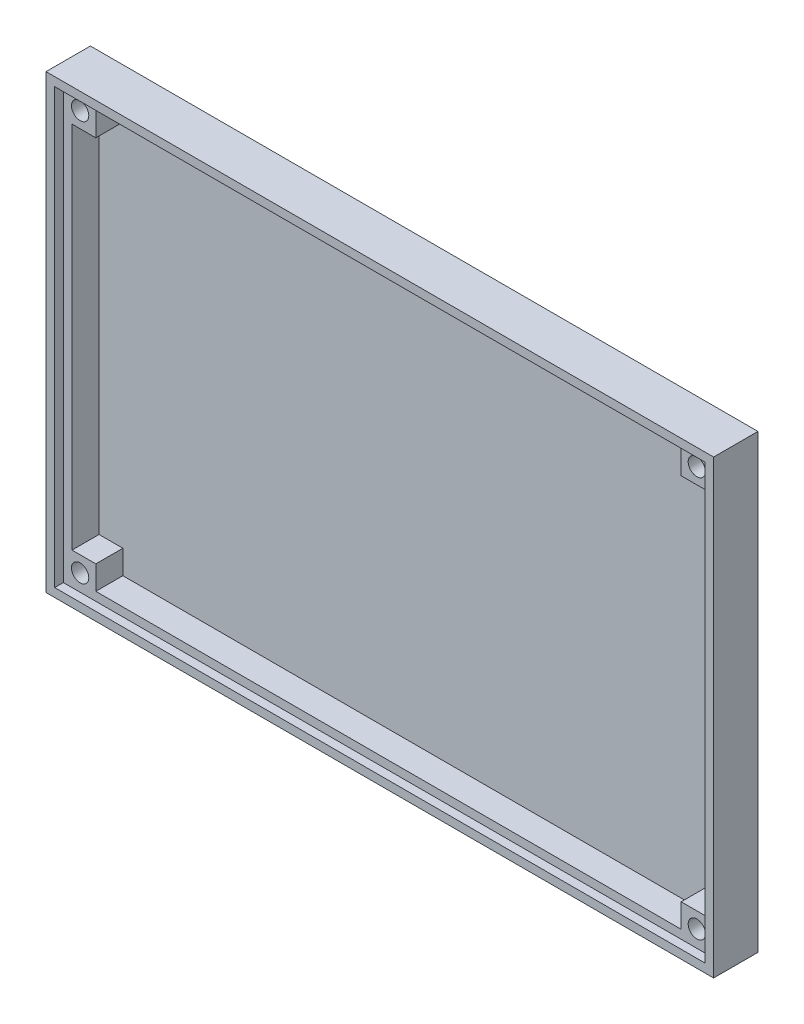
ISO-10303-21;
HEADER;
FILE_DESCRIPTION(('STEP AP214'),'2;1');
FILE_NAME('part.step','',(''),(''),'','','');
FILE_SCHEMA(('AUTOMOTIVE_DESIGN { 1 0 10303 214 1 1 1 1 }'));
ENDSEC;
DATA;
#1=APPLICATION_CONTEXT('core data for automotive mechanical design processes');
#2=APPLICATION_PROTOCOL_DEFINITION('international standard','automotive_design',2000,#1);
#3=PRODUCT_CONTEXT('',#1,'mechanical');
#4=PRODUCT('Part','Part','',(#3));
#5=PRODUCT_RELATED_PRODUCT_CATEGORY('part','',(#4));
#6=PRODUCT_DEFINITION_FORMATION('','',#4);
#7=PRODUCT_DEFINITION_CONTEXT('part definition',#1,'design');
#8=PRODUCT_DEFINITION('design','',#6,#7);
#9=PRODUCT_DEFINITION_SHAPE('','',#8);
#10=(LENGTH_UNIT() NAMED_UNIT(*) SI_UNIT(.MILLI.,.METRE.));
#11=(NAMED_UNIT(*) PLANE_ANGLE_UNIT() SI_UNIT($,.RADIAN.));
#12=(NAMED_UNIT(*) SI_UNIT($,.STERADIAN.) SOLID_ANGLE_UNIT());
#13=UNCERTAINTY_MEASURE_WITH_UNIT(LENGTH_MEASURE(1.E-05),#10,'distance_accuracy_value','');
#14=(GEOMETRIC_REPRESENTATION_CONTEXT(3) GLOBAL_UNCERTAINTY_ASSIGNED_CONTEXT((#13)) GLOBAL_UNIT_ASSIGNED_CONTEXT((#10,
#11,#12)) REPRESENTATION_CONTEXT('',''));
#15=CARTESIAN_POINT('',(0.,0.,0.));
#16=DIRECTION('',(0.,0.,1.));
#17=DIRECTION('',(1.,0.,0.));
#18=AXIS2_PLACEMENT_3D('',#15,#16,#17);
#19=CARTESIAN_POINT('',(0.,0.,8.2));
#20=DIRECTION('',(0.,0.,1.));
#21=DIRECTION('',(1.,0.,0.));
#22=AXIS2_PLACEMENT_3D('',#19,#20,#21);
#23=PLANE('',#22);
#24=DIRECTION('',(-1.,0.,0.));
#25=VECTOR('',#24,1.);
#26=CARTESIAN_POINT('',(61.7,41.7,8.2));
#27=LINE('',#26,#25);
#28=CARTESIAN_POINT('',(61.7,41.7,8.2));
#29=VERTEX_POINT('',#28);
#30=CARTESIAN_POINT('',(-61.7,41.7,8.2));
#31=VERTEX_POINT('',#30);
#32=EDGE_CURVE('E356',#29,#31,#27,.T.);
#33=ORIENTED_EDGE('',*,*,#32,.T.);
#34=DIRECTION('',(0.,-1.,0.));
#35=VECTOR('',#34,1.);
#36=CARTESIAN_POINT('',(-61.7,41.7,8.2));
#37=LINE('',#36,#35);
#38=CARTESIAN_POINT('',(-61.7,-41.7,8.2));
#39=VERTEX_POINT('',#38);
#40=EDGE_CURVE('E360',#31,#39,#37,.T.);
#41=ORIENTED_EDGE('',*,*,#40,.T.);
#42=DIRECTION('',(1.,0.,0.));
#43=VECTOR('',#42,1.);
#44=CARTESIAN_POINT('',(-61.7,-41.7,8.2));
#45=LINE('',#44,#43);
#46=CARTESIAN_POINT('',(61.7,-41.7,8.2));
#47=VERTEX_POINT('',#46);
#48=EDGE_CURVE('E364',#39,#47,#45,.T.);
#49=ORIENTED_EDGE('',*,*,#48,.T.);
#50=DIRECTION('',(0.,1.,0.));
#51=VECTOR('',#50,1.);
#52=CARTESIAN_POINT('',(61.7,-41.7,8.2));
#53=LINE('',#52,#51);
#54=EDGE_CURVE('E367',#47,#29,#53,.T.);
#55=ORIENTED_EDGE('',*,*,#54,.T.);
#56=EDGE_LOOP('',(#33,#41,#49,#55));
#57=FACE_BOUND('',#56,.T.);
#58=DIRECTION('',(0.,-1.,0.));
#59=VECTOR('',#58,1.);
#60=CARTESIAN_POINT('',(-60.1,40.1,8.2));
#61=LINE('',#60,#59);
#62=CARTESIAN_POINT('',(-60.1,40.1,8.2));
#63=VERTEX_POINT('',#62);
#64=CARTESIAN_POINT('',(-60.1,-40.1,8.2));
#65=VERTEX_POINT('',#64);
#66=EDGE_CURVE('E330',#63,#65,#61,.T.);
#67=ORIENTED_EDGE('',*,*,#66,.F.);
#68=DIRECTION('',(-1.,0.,0.));
#69=VECTOR('',#68,1.);
#70=CARTESIAN_POINT('',(60.1,40.1,8.2));
#71=LINE('',#70,#69);
#72=CARTESIAN_POINT('',(60.1,40.1,8.2));
#73=VERTEX_POINT('',#72);
#74=EDGE_CURVE('E327',#73,#63,#71,.T.);
#75=ORIENTED_EDGE('',*,*,#74,.F.);
#76=DIRECTION('',(0.,1.,0.));
#77=VECTOR('',#76,1.);
#78=CARTESIAN_POINT('',(60.1,-40.1,8.2));
#79=LINE('',#78,#77);
#80=CARTESIAN_POINT('',(60.1,-40.1,8.2));
#81=VERTEX_POINT('',#80);
#82=EDGE_CURVE('E337',#81,#73,#79,.T.);
#83=ORIENTED_EDGE('',*,*,#82,.F.);
#84=DIRECTION('',(1.,0.,0.));
#85=VECTOR('',#84,1.);
#86=CARTESIAN_POINT('',(-60.1,-40.1,8.2));
#87=LINE('',#86,#85);
#88=EDGE_CURVE('E333',#65,#81,#87,.T.);
#89=ORIENTED_EDGE('',*,*,#88,.F.);
#90=EDGE_LOOP('',(#67,#75,#83,#89));
#91=FACE_BOUND('',#90,.T.);
#92=ADVANCED_FACE('F43',(#57,#91),#23,.T.);
#93=CARTESIAN_POINT('',(61.7,41.7,8.2));
#94=DIRECTION('',(0.,-1.,0.));
#95=DIRECTION('',(1.,0.,0.));
#96=AXIS2_PLACEMENT_3D('',#93,#94,#95);
#97=PLANE('',#96);
#98=DIRECTION('',(-1.,0.,0.));
#99=VECTOR('',#98,1.);
#100=CARTESIAN_POINT('',(61.7,41.7,0.));
#101=LINE('',#100,#99);
#102=CARTESIAN_POINT('',(61.7,41.7,0.));
#103=VERTEX_POINT('',#102);
#104=CARTESIAN_POINT('',(-61.7,41.7,0.));
#105=VERTEX_POINT('',#104);
#106=EDGE_CURVE('E355',#103,#105,#101,.T.);
#107=ORIENTED_EDGE('',*,*,#106,.T.);
#108=DIRECTION('',(0.,0.,-1.));
#109=VECTOR('',#108,1.);
#110=CARTESIAN_POINT('',(-61.7,41.7,8.2));
#111=LINE('',#110,#109);
#112=EDGE_CURVE('E11',#31,#105,#111,.T.);
#113=ORIENTED_EDGE('',*,*,#112,.F.);
#114=ORIENTED_EDGE('',*,*,#32,.F.);
#115=DIRECTION('',(0.,0.,-1.));
#116=VECTOR('',#115,1.);
#117=CARTESIAN_POINT('',(61.7,41.7,8.2));
#118=LINE('',#117,#116);
#119=EDGE_CURVE('E370',#29,#103,#118,.T.);
#120=ORIENTED_EDGE('',*,*,#119,.T.);
#121=EDGE_LOOP('',(#107,#113,#114,#120));
#122=FACE_BOUND('',#121,.T.);
#123=ADVANCED_FACE('F406',(#122),#97,.F.);
#124=CARTESIAN_POINT('',(-61.7,41.7,8.2));
#125=DIRECTION('',(1.,0.,0.));
#126=DIRECTION('',(0.,1.,0.));
#127=AXIS2_PLACEMENT_3D('',#124,#125,#126);
#128=PLANE('',#127);
#129=DIRECTION('',(0.,-1.,0.));
#130=VECTOR('',#129,1.);
#131=CARTESIAN_POINT('',(-61.7,41.7,0.));
#132=LINE('',#131,#130);
#133=CARTESIAN_POINT('',(-61.7,-41.7,0.));
#134=VERTEX_POINT('',#133);
#135=EDGE_CURVE('E374',#105,#134,#132,.T.);
#136=ORIENTED_EDGE('',*,*,#135,.T.);
#137=DIRECTION('',(0.,0.,-1.));
#138=VECTOR('',#137,1.);
#139=CARTESIAN_POINT('',(-61.7,-41.7,8.2));
#140=LINE('',#139,#138);
#141=EDGE_CURVE('E52',#39,#134,#140,.T.);
#142=ORIENTED_EDGE('',*,*,#141,.F.);
#143=ORIENTED_EDGE('',*,*,#40,.F.);
#144=ORIENTED_EDGE('',*,*,#112,.T.);
#145=EDGE_LOOP('',(#136,#142,#143,#144));
#146=FACE_BOUND('',#145,.T.);
#147=ADVANCED_FACE('F410',(#146),#128,.F.);
#148=CARTESIAN_POINT('',(-61.7,-41.7,8.2));
#149=DIRECTION('',(0.,1.,0.));
#150=DIRECTION('',(0.,0.,1.));
#151=AXIS2_PLACEMENT_3D('',#148,#149,#150);
#152=PLANE('',#151);
#153=DIRECTION('',(1.,0.,0.));
#154=VECTOR('',#153,1.);
#155=CARTESIAN_POINT('',(-61.7,-41.7,0.));
#156=LINE('',#155,#154);
#157=CARTESIAN_POINT('',(61.7,-41.7,0.));
#158=VERTEX_POINT('',#157);
#159=EDGE_CURVE('E377',#134,#158,#156,.T.);
#160=ORIENTED_EDGE('',*,*,#159,.T.);
#161=DIRECTION('',(0.,0.,-1.));
#162=VECTOR('',#161,1.);
#163=CARTESIAN_POINT('',(61.7,-41.7,8.2));
#164=LINE('',#163,#162);
#165=EDGE_CURVE('E385',#47,#158,#164,.T.);
#166=ORIENTED_EDGE('',*,*,#165,.F.);
#167=ORIENTED_EDGE('',*,*,#48,.F.);
#168=ORIENTED_EDGE('',*,*,#141,.T.);
#169=EDGE_LOOP('',(#160,#166,#167,#168));
#170=FACE_BOUND('',#169,.T.);
#171=ADVANCED_FACE('F394',(#170),#152,.F.);
#172=CARTESIAN_POINT('',(61.7,-41.7,8.2));
#173=DIRECTION('',(-1.,0.,0.));
#174=DIRECTION('',(0.,-1.,0.));
#175=AXIS2_PLACEMENT_3D('',#172,#173,#174);
#176=PLANE('',#175);
#177=DIRECTION('',(0.,1.,0.));
#178=VECTOR('',#177,1.);
#179=CARTESIAN_POINT('',(61.7,-41.7,0.));
#180=LINE('',#179,#178);
#181=EDGE_CURVE('E361',#158,#103,#180,.T.);
#182=ORIENTED_EDGE('',*,*,#181,.T.);
#183=ORIENTED_EDGE('',*,*,#119,.F.);
#184=ORIENTED_EDGE('',*,*,#54,.F.);
#185=ORIENTED_EDGE('',*,*,#165,.T.);
#186=EDGE_LOOP('',(#182,#183,#184,#185));
#187=FACE_BOUND('',#186,.T.);
#188=ADVANCED_FACE('F402',(#187),#176,.F.);
#189=CARTESIAN_POINT('',(60.1,40.1,8.2));
#190=DIRECTION('',(0.,-1.,0.));
#191=DIRECTION('',(0.,0.,-1.));
#192=AXIS2_PLACEMENT_3D('',#189,#190,#191);
#193=PLANE('',#192);
#194=DIRECTION('',(-1.,0.,0.));
#195=VECTOR('',#194,1.);
#196=CARTESIAN_POINT('',(60.1,40.1,6.6));
#197=LINE('',#196,#195);
#198=CARTESIAN_POINT('',(60.1,40.1,6.6));
#199=VERTEX_POINT('',#198);
#200=CARTESIAN_POINT('',(-60.1,40.1,6.6));
#201=VERTEX_POINT('',#200);
#202=EDGE_CURVE('E323',#199,#201,#197,.T.);
#203=ORIENTED_EDGE('',*,*,#202,.F.);
#204=DIRECTION('',(0.,0.,-1.));
#205=VECTOR('',#204,1.);
#206=CARTESIAN_POINT('',(60.1,40.1,8.2));
#207=LINE('',#206,#205);
#208=EDGE_CURVE('E340',#73,#199,#207,.T.);
#209=ORIENTED_EDGE('',*,*,#208,.F.);
#210=ORIENTED_EDGE('',*,*,#74,.T.);
#211=DIRECTION('',(0.,0.,-1.));
#212=VECTOR('',#211,1.);
#213=CARTESIAN_POINT('',(-60.1,40.1,8.2));
#214=LINE('',#213,#212);
#215=EDGE_CURVE('E351',#63,#201,#214,.T.);
#216=ORIENTED_EDGE('',*,*,#215,.T.);
#217=EDGE_LOOP('',(#203,#209,#210,#216));
#218=FACE_BOUND('',#217,.T.);
#219=ADVANCED_FACE('F425',(#218),#193,.T.);
#220=CARTESIAN_POINT('',(-60.1,40.1,8.2));
#221=DIRECTION('',(1.,0.,0.));
#222=DIRECTION('',(0.,0.,-1.));
#223=AXIS2_PLACEMENT_3D('',#220,#221,#222);
#224=PLANE('',#223);
#225=DIRECTION('',(0.,-1.,0.));
#226=VECTOR('',#225,1.);
#227=CARTESIAN_POINT('',(-60.1,-40.1,6.6));
#228=LINE('',#227,#226);
#229=CARTESIAN_POINT('',(-60.1,-40.1,6.6));
#230=VERTEX_POINT('',#229);
#231=EDGE_CURVE('E197',#201,#230,#228,.T.);
#232=ORIENTED_EDGE('',*,*,#231,.F.);
#233=ORIENTED_EDGE('',*,*,#215,.F.);
#234=ORIENTED_EDGE('',*,*,#66,.T.);
#235=DIRECTION('',(0.,0.,-1.));
#236=VECTOR('',#235,1.);
#237=CARTESIAN_POINT('',(-60.1,-40.1,8.2));
#238=LINE('',#237,#236);
#239=EDGE_CURVE('E347',#65,#230,#238,.T.);
#240=ORIENTED_EDGE('',*,*,#239,.T.);
#241=EDGE_LOOP('',(#232,#233,#234,#240));
#242=FACE_BOUND('',#241,.T.);
#243=ADVANCED_FACE('F431',(#242),#224,.T.);
#244=CARTESIAN_POINT('',(-60.1,-40.1,8.2));
#245=DIRECTION('',(0.,1.,0.));
#246=DIRECTION('',(0.,0.,1.));
#247=AXIS2_PLACEMENT_3D('',#244,#245,#246);
#248=PLANE('',#247);
#249=DIRECTION('',(1.,0.,0.));
#250=VECTOR('',#249,1.);
#251=CARTESIAN_POINT('',(60.1,-40.1,6.6));
#252=LINE('',#251,#250);
#253=CARTESIAN_POINT('',(60.1,-40.1,6.6));
#254=VERTEX_POINT('',#253);
#255=EDGE_CURVE('E315',#230,#254,#252,.T.);
#256=ORIENTED_EDGE('',*,*,#255,.F.);
#257=ORIENTED_EDGE('',*,*,#239,.F.);
#258=ORIENTED_EDGE('',*,*,#88,.T.);
#259=DIRECTION('',(0.,0.,-1.));
#260=VECTOR('',#259,1.);
#261=CARTESIAN_POINT('',(60.1,-40.1,8.2));
#262=LINE('',#261,#260);
#263=EDGE_CURVE('E343',#81,#254,#262,.T.);
#264=ORIENTED_EDGE('',*,*,#263,.T.);
#265=EDGE_LOOP('',(#256,#257,#258,#264));
#266=FACE_BOUND('',#265,.T.);
#267=ADVANCED_FACE('F436',(#266),#248,.T.);
#268=CARTESIAN_POINT('',(60.1,-40.1,8.2));
#269=DIRECTION('',(-1.,0.,0.));
#270=DIRECTION('',(0.,0.,1.));
#271=AXIS2_PLACEMENT_3D('',#268,#269,#270);
#272=PLANE('',#271);
#273=DIRECTION('',(0.,1.,0.));
#274=VECTOR('',#273,1.);
#275=CARTESIAN_POINT('',(60.1,40.1,6.6));
#276=LINE('',#275,#274);
#277=EDGE_CURVE('E319',#254,#199,#276,.T.);
#278=ORIENTED_EDGE('',*,*,#277,.F.);
#279=ORIENTED_EDGE('',*,*,#263,.F.);
#280=ORIENTED_EDGE('',*,*,#82,.T.);
#281=ORIENTED_EDGE('',*,*,#208,.T.);
#282=EDGE_LOOP('',(#278,#279,#280,#281));
#283=FACE_BOUND('',#282,.T.);
#284=ADVANCED_FACE('F444',(#283),#272,.T.);
#285=CARTESIAN_POINT('',(0.,0.,0.));
#286=DIRECTION('',(0.,0.,1.));
#287=DIRECTION('',(1.,0.,0.));
#288=AXIS2_PLACEMENT_3D('',#285,#286,#287);
#289=PLANE('',#288);
#290=ORIENTED_EDGE('',*,*,#106,.F.);
#291=ORIENTED_EDGE('',*,*,#181,.F.);
#292=ORIENTED_EDGE('',*,*,#159,.F.);
#293=ORIENTED_EDGE('',*,*,#135,.F.);
#294=EDGE_LOOP('',(#290,#291,#292,#293));
#295=FACE_BOUND('',#294,.T.);
#296=ADVANCED_FACE('F45',(#295),#289,.F.);
#297=CARTESIAN_POINT('',(0.,0.,6.6));
#298=DIRECTION('',(0.,0.,1.));
#299=DIRECTION('',(1.,0.,0.));
#300=AXIS2_PLACEMENT_3D('',#297,#298,#299);
#301=PLANE('',#300);
#302=CARTESIAN_POINT('',(-57.,-37.,6.6));
#303=DIRECTION('',(0.,0.,1.));
#304=DIRECTION('',(1.,0.,0.));
#305=AXIS2_PLACEMENT_3D('',#302,#303,#304);
#306=CIRCLE('',#305,1.6);
#307=CARTESIAN_POINT('',(-55.4,-37.,6.6));
#308=VERTEX_POINT('',#307);
#309=EDGE_CURVE('E562',#308,#308,#306,.T.);
#310=ORIENTED_EDGE('',*,*,#309,.F.);
#311=EDGE_LOOP('',(#310));
#312=FACE_BOUND('',#311,.T.);
#313=CARTESIAN_POINT('',(57.,-37.,6.6));
#314=DIRECTION('',(0.,0.,1.));
#315=DIRECTION('',(1.,0.,0.));
#316=AXIS2_PLACEMENT_3D('',#313,#314,#315);
#317=CIRCLE('',#316,1.6);
#318=CARTESIAN_POINT('',(58.6,-37.,6.6));
#319=VERTEX_POINT('',#318);
#320=EDGE_CURVE('E552',#319,#319,#317,.T.);
#321=ORIENTED_EDGE('',*,*,#320,.F.);
#322=EDGE_LOOP('',(#321));
#323=FACE_BOUND('',#322,.T.);
#324=CARTESIAN_POINT('',(57.,37.,6.6));
#325=DIRECTION('',(0.,0.,1.));
#326=DIRECTION('',(1.,0.,0.));
#327=AXIS2_PLACEMENT_3D('',#324,#325,#326);
#328=CIRCLE('',#327,1.6);
#329=CARTESIAN_POINT('',(58.6,37.,6.6));
#330=VERTEX_POINT('',#329);
#331=EDGE_CURVE('E544',#330,#330,#328,.T.);
#332=ORIENTED_EDGE('',*,*,#331,.F.);
#333=EDGE_LOOP('',(#332));
#334=FACE_BOUND('',#333,.T.);
#335=CARTESIAN_POINT('',(-57.,37.,6.6));
#336=DIRECTION('',(0.,0.,1.));
#337=DIRECTION('',(1.,0.,0.));
#338=AXIS2_PLACEMENT_3D('',#335,#336,#337);
#339=CIRCLE('',#338,1.6);
#340=CARTESIAN_POINT('',(-55.4,37.,6.6));
#341=VERTEX_POINT('',#340);
#342=EDGE_CURVE('E547',#341,#341,#339,.T.);
#343=ORIENTED_EDGE('',*,*,#342,.F.);
#344=EDGE_LOOP('',(#343));
#345=FACE_BOUND('',#344,.T.);
#346=ORIENTED_EDGE('',*,*,#231,.T.);
#347=ORIENTED_EDGE('',*,*,#255,.T.);
#348=ORIENTED_EDGE('',*,*,#277,.T.);
#349=ORIENTED_EDGE('',*,*,#202,.T.);
#350=EDGE_LOOP('',(#346,#347,#348,#349));
#351=FACE_BOUND('',#350,.T.);
#352=DIRECTION('',(-1.,0.,0.));
#353=VECTOR('',#352,1.);
#354=CARTESIAN_POINT('',(-58.5,34.1,6.6));
#355=LINE('',#354,#353);
#356=CARTESIAN_POINT('',(-54.1,34.1,6.6));
#357=VERTEX_POINT('',#356);
#358=CARTESIAN_POINT('',(-58.5,34.1,6.6));
#359=VERTEX_POINT('',#358);
#360=EDGE_CURVE('E190',#357,#359,#355,.T.);
#361=ORIENTED_EDGE('',*,*,#360,.F.);
#362=DIRECTION('',(0.,-1.,0.));
#363=VECTOR('',#362,1.);
#364=CARTESIAN_POINT('',(-54.1,38.5,6.6));
#365=LINE('',#364,#363);
#366=CARTESIAN_POINT('',(-54.1,38.5,6.6));
#367=VERTEX_POINT('',#366);
#368=EDGE_CURVE('E180',#367,#357,#365,.T.);
#369=ORIENTED_EDGE('',*,*,#368,.F.);
#370=DIRECTION('',(-1.,0.,0.));
#371=VECTOR('',#370,1.);
#372=CARTESIAN_POINT('',(54.1,38.5,6.6));
#373=LINE('',#372,#371);
#374=CARTESIAN_POINT('',(54.1,38.5,6.6));
#375=VERTEX_POINT('',#374);
#376=EDGE_CURVE('E235',#375,#367,#373,.T.);
#377=ORIENTED_EDGE('',*,*,#376,.F.);
#378=DIRECTION('',(0.,1.,0.));
#379=VECTOR('',#378,1.);
#380=CARTESIAN_POINT('',(54.1,38.5,6.6));
#381=LINE('',#380,#379);
#382=CARTESIAN_POINT('',(54.1,34.1,6.6));
#383=VERTEX_POINT('',#382);
#384=EDGE_CURVE('E231',#383,#375,#381,.T.);
#385=ORIENTED_EDGE('',*,*,#384,.F.);
#386=DIRECTION('',(-1.,0.,0.));
#387=VECTOR('',#386,1.);
#388=CARTESIAN_POINT('',(58.5,34.1,6.6));
#389=LINE('',#388,#387);
#390=CARTESIAN_POINT('',(58.5,34.1,6.6));
#391=VERTEX_POINT('',#390);
#392=EDGE_CURVE('E228',#391,#383,#389,.T.);
#393=ORIENTED_EDGE('',*,*,#392,.F.);
#394=DIRECTION('',(0.,1.,0.));
#395=VECTOR('',#394,1.);
#396=CARTESIAN_POINT('',(58.5,34.1,6.6));
#397=LINE('',#396,#395);
#398=CARTESIAN_POINT('',(58.5,-34.1,6.6));
#399=VERTEX_POINT('',#398);
#400=EDGE_CURVE('E225',#399,#391,#397,.T.);
#401=ORIENTED_EDGE('',*,*,#400,.F.);
#402=DIRECTION('',(1.,0.,0.));
#403=VECTOR('',#402,1.);
#404=CARTESIAN_POINT('',(58.5,-34.1,6.6));
#405=LINE('',#404,#403);
#406=CARTESIAN_POINT('',(54.1,-34.1,6.6));
#407=VERTEX_POINT('',#406);
#408=EDGE_CURVE('E222',#407,#399,#405,.T.);
#409=ORIENTED_EDGE('',*,*,#408,.F.);
#410=DIRECTION('',(0.,1.,0.));
#411=VECTOR('',#410,1.);
#412=CARTESIAN_POINT('',(54.1,-38.5,6.6));
#413=LINE('',#412,#411);
#414=CARTESIAN_POINT('',(54.1,-38.5,6.6));
#415=VERTEX_POINT('',#414);
#416=EDGE_CURVE('E219',#415,#407,#413,.T.);
#417=ORIENTED_EDGE('',*,*,#416,.F.);
#418=DIRECTION('',(1.,0.,0.));
#419=VECTOR('',#418,1.);
#420=CARTESIAN_POINT('',(54.1,-38.5,6.6));
#421=LINE('',#420,#419);
#422=CARTESIAN_POINT('',(-54.1,-38.5,6.6));
#423=VERTEX_POINT('',#422);
#424=EDGE_CURVE('E216',#423,#415,#421,.T.);
#425=ORIENTED_EDGE('',*,*,#424,.F.);
#426=DIRECTION('',(0.,-1.,0.));
#427=VECTOR('',#426,1.);
#428=CARTESIAN_POINT('',(-54.1,-38.5,6.6));
#429=LINE('',#428,#427);
#430=CARTESIAN_POINT('',(-54.1,-34.1,6.6));
#431=VERTEX_POINT('',#430);
#432=EDGE_CURVE('E213',#431,#423,#429,.T.);
#433=ORIENTED_EDGE('',*,*,#432,.F.);
#434=DIRECTION('',(1.,0.,0.));
#435=VECTOR('',#434,1.);
#436=CARTESIAN_POINT('',(-58.5,-34.1,6.6));
#437=LINE('',#436,#435);
#438=CARTESIAN_POINT('',(-58.5,-34.1,6.6));
#439=VERTEX_POINT('',#438);
#440=EDGE_CURVE('E207',#439,#431,#437,.T.);
#441=ORIENTED_EDGE('',*,*,#440,.F.);
#442=DIRECTION('',(0.,-1.,0.));
#443=VECTOR('',#442,1.);
#444=CARTESIAN_POINT('',(-58.5,-34.1,6.6));
#445=LINE('',#444,#443);
#446=EDGE_CURVE('E203',#359,#439,#445,.T.);
#447=ORIENTED_EDGE('',*,*,#446,.F.);
#448=EDGE_LOOP('',(#361,#369,#377,#385,#393,#401,#409,#417,#425,#433,#441,#447));
#449=FACE_BOUND('',#448,.T.);
#450=ADVANCED_FACE('F201',(#312,#323,#334,#345,#351,#449),#301,.T.);
#451=CARTESIAN_POINT('',(-54.1,38.5,6.6));
#452=DIRECTION('',(1.,0.,0.));
#453=DIRECTION('',(0.,1.,0.));
#454=AXIS2_PLACEMENT_3D('',#451,#452,#453);
#455=PLANE('',#454);
#456=DIRECTION('',(0.,-1.,0.));
#457=VECTOR('',#456,1.);
#458=CARTESIAN_POINT('',(-54.1,38.5,1.6));
#459=LINE('',#458,#457);
#460=CARTESIAN_POINT('',(-54.1,38.5,1.6));
#461=VERTEX_POINT('',#460);
#462=CARTESIAN_POINT('',(-54.1,34.1,1.6));
#463=VERTEX_POINT('',#462);
#464=EDGE_CURVE('E59',#461,#463,#459,.T.);
#465=ORIENTED_EDGE('',*,*,#464,.F.);
#466=DIRECTION('',(0.,0.,-1.));
#467=VECTOR('',#466,1.);
#468=CARTESIAN_POINT('',(-54.1,38.5,6.6));
#469=LINE('',#468,#467);
#470=EDGE_CURVE('E185',#367,#461,#469,.T.);
#471=ORIENTED_EDGE('',*,*,#470,.F.);
#472=ORIENTED_EDGE('',*,*,#368,.T.);
#473=DIRECTION('',(0.,0.,-1.));
#474=VECTOR('',#473,1.);
#475=CARTESIAN_POINT('',(-54.1,34.1,6.6));
#476=LINE('',#475,#474);
#477=EDGE_CURVE('E183',#357,#463,#476,.T.);
#478=ORIENTED_EDGE('',*,*,#477,.T.);
#479=EDGE_LOOP('',(#465,#471,#472,#478));
#480=FACE_BOUND('',#479,.T.);
#481=ADVANCED_FACE('F182',(#480),#455,.T.);
#482=CARTESIAN_POINT('',(-58.5,34.1,6.6));
#483=DIRECTION('',(0.,-1.,0.));
#484=DIRECTION('',(0.,0.,-1.));
#485=AXIS2_PLACEMENT_3D('',#482,#483,#484);
#486=PLANE('',#485);
#487=DIRECTION('',(-1.,0.,0.));
#488=VECTOR('',#487,1.);
#489=CARTESIAN_POINT('',(-58.5,34.1,1.6));
#490=LINE('',#489,#488);
#491=CARTESIAN_POINT('',(-58.5,34.1,1.6));
#492=VERTEX_POINT('',#491);
#493=EDGE_CURVE('E63',#463,#492,#490,.T.);
#494=ORIENTED_EDGE('',*,*,#493,.F.);
#495=ORIENTED_EDGE('',*,*,#477,.F.);
#496=ORIENTED_EDGE('',*,*,#360,.T.);
#497=DIRECTION('',(0.,0.,-1.));
#498=VECTOR('',#497,1.);
#499=CARTESIAN_POINT('',(-58.5,34.1,6.6));
#500=LINE('',#499,#498);
#501=EDGE_CURVE('E198',#359,#492,#500,.T.);
#502=ORIENTED_EDGE('',*,*,#501,.T.);
#503=EDGE_LOOP('',(#494,#495,#496,#502));
#504=FACE_BOUND('',#503,.T.);
#505=ADVANCED_FACE('F194',(#504),#486,.T.);
#506=CARTESIAN_POINT('',(-58.5,-34.1,6.6));
#507=DIRECTION('',(1.,0.,0.));
#508=DIRECTION('',(0.,0.,-1.));
#509=AXIS2_PLACEMENT_3D('',#506,#507,#508);
#510=PLANE('',#509);
#511=DIRECTION('',(0.,-1.,0.));
#512=VECTOR('',#511,1.);
#513=CARTESIAN_POINT('',(-58.5,-34.1,1.6));
#514=LINE('',#513,#512);
#515=CARTESIAN_POINT('',(-58.5,-34.1,1.6));
#516=VERTEX_POINT('',#515);
#517=EDGE_CURVE('E243',#492,#516,#514,.T.);
#518=ORIENTED_EDGE('',*,*,#517,.F.);
#519=ORIENTED_EDGE('',*,*,#501,.F.);
#520=ORIENTED_EDGE('',*,*,#446,.T.);
#521=DIRECTION('',(0.,0.,-1.));
#522=VECTOR('',#521,1.);
#523=CARTESIAN_POINT('',(-58.5,-34.1,6.6));
#524=LINE('',#523,#522);
#525=EDGE_CURVE('E306',#439,#516,#524,.T.);
#526=ORIENTED_EDGE('',*,*,#525,.T.);
#527=EDGE_LOOP('',(#518,#519,#520,#526));
#528=FACE_BOUND('',#527,.T.);
#529=ADVANCED_FACE('F464',(#528),#510,.T.);
#530=CARTESIAN_POINT('',(-58.5,-34.1,6.6));
#531=DIRECTION('',(0.,1.,0.));
#532=DIRECTION('',(-1.,0.,0.));
#533=AXIS2_PLACEMENT_3D('',#530,#531,#532);
#534=PLANE('',#533);
#535=DIRECTION('',(1.,0.,0.));
#536=VECTOR('',#535,1.);
#537=CARTESIAN_POINT('',(-58.5,-34.1,1.6));
#538=LINE('',#537,#536);
#539=CARTESIAN_POINT('',(-54.1,-34.1,1.6));
#540=VERTEX_POINT('',#539);
#541=EDGE_CURVE('E246',#516,#540,#538,.T.);
#542=ORIENTED_EDGE('',*,*,#541,.F.);
#543=ORIENTED_EDGE('',*,*,#525,.F.);
#544=ORIENTED_EDGE('',*,*,#440,.T.);
#545=DIRECTION('',(0.,0.,-1.));
#546=VECTOR('',#545,1.);
#547=CARTESIAN_POINT('',(-54.1,-34.1,6.6));
#548=LINE('',#547,#546);
#549=EDGE_CURVE('E302',#431,#540,#548,.T.);
#550=ORIENTED_EDGE('',*,*,#549,.T.);
#551=EDGE_LOOP('',(#542,#543,#544,#550));
#552=FACE_BOUND('',#551,.T.);
#553=ADVANCED_FACE('F467',(#552),#534,.T.);
#554=CARTESIAN_POINT('',(-54.1,-38.5,6.6));
#555=DIRECTION('',(1.,0.,0.));
#556=DIRECTION('',(0.,0.,-1.));
#557=AXIS2_PLACEMENT_3D('',#554,#555,#556);
#558=PLANE('',#557);
#559=DIRECTION('',(0.,-1.,0.));
#560=VECTOR('',#559,1.);
#561=CARTESIAN_POINT('',(-54.1,-38.5,1.6));
#562=LINE('',#561,#560);
#563=CARTESIAN_POINT('',(-54.1,-38.5,1.6));
#564=VERTEX_POINT('',#563);
#565=EDGE_CURVE('E249',#540,#564,#562,.T.);
#566=ORIENTED_EDGE('',*,*,#565,.F.);
#567=ORIENTED_EDGE('',*,*,#549,.F.);
#568=ORIENTED_EDGE('',*,*,#432,.T.);
#569=DIRECTION('',(0.,0.,-1.));
#570=VECTOR('',#569,1.);
#571=CARTESIAN_POINT('',(-54.1,-38.5,6.6));
#572=LINE('',#571,#570);
#573=EDGE_CURVE('E298',#423,#564,#572,.T.);
#574=ORIENTED_EDGE('',*,*,#573,.T.);
#575=EDGE_LOOP('',(#566,#567,#568,#574));
#576=FACE_BOUND('',#575,.T.);
#577=ADVANCED_FACE('F471',(#576),#558,.T.);
#578=CARTESIAN_POINT('',(54.1,-38.5,6.6));
#579=DIRECTION('',(0.,1.,0.));
#580=DIRECTION('',(-1.,0.,0.));
#581=AXIS2_PLACEMENT_3D('',#578,#579,#580);
#582=PLANE('',#581);
#583=DIRECTION('',(1.,0.,0.));
#584=VECTOR('',#583,1.);
#585=CARTESIAN_POINT('',(54.1,-38.5,1.6));
#586=LINE('',#585,#584);
#587=CARTESIAN_POINT('',(54.1,-38.5,1.6));
#588=VERTEX_POINT('',#587);
#589=EDGE_CURVE('E252',#564,#588,#586,.T.);
#590=ORIENTED_EDGE('',*,*,#589,.F.);
#591=ORIENTED_EDGE('',*,*,#573,.F.);
#592=ORIENTED_EDGE('',*,*,#424,.T.);
#593=DIRECTION('',(0.,0.,-1.));
#594=VECTOR('',#593,1.);
#595=CARTESIAN_POINT('',(54.1,-38.5,6.6));
#596=LINE('',#595,#594);
#597=EDGE_CURVE('E294',#415,#588,#596,.T.);
#598=ORIENTED_EDGE('',*,*,#597,.T.);
#599=EDGE_LOOP('',(#590,#591,#592,#598));
#600=FACE_BOUND('',#599,.T.);
#601=ADVANCED_FACE('F475',(#600),#582,.T.);
#602=CARTESIAN_POINT('',(54.1,-38.5,6.6));
#603=DIRECTION('',(-1.,0.,0.));
#604=DIRECTION('',(0.,-1.,0.));
#605=AXIS2_PLACEMENT_3D('',#602,#603,#604);
#606=PLANE('',#605);
#607=DIRECTION('',(0.,1.,0.));
#608=VECTOR('',#607,1.);
#609=CARTESIAN_POINT('',(54.1,-38.5,1.6));
#610=LINE('',#609,#608);
#611=CARTESIAN_POINT('',(54.1,-34.1,1.6));
#612=VERTEX_POINT('',#611);
#613=EDGE_CURVE('E255',#588,#612,#610,.T.);
#614=ORIENTED_EDGE('',*,*,#613,.F.);
#615=ORIENTED_EDGE('',*,*,#597,.F.);
#616=ORIENTED_EDGE('',*,*,#416,.T.);
#617=DIRECTION('',(0.,0.,-1.));
#618=VECTOR('',#617,1.);
#619=CARTESIAN_POINT('',(54.1,-34.1,6.6));
#620=LINE('',#619,#618);
#621=EDGE_CURVE('E290',#407,#612,#620,.T.);
#622=ORIENTED_EDGE('',*,*,#621,.T.);
#623=EDGE_LOOP('',(#614,#615,#616,#622));
#624=FACE_BOUND('',#623,.T.);
#625=ADVANCED_FACE('F479',(#624),#606,.T.);
#626=CARTESIAN_POINT('',(58.5,-34.1,6.6));
#627=DIRECTION('',(0.,1.,0.));
#628=DIRECTION('',(0.,0.,1.));
#629=AXIS2_PLACEMENT_3D('',#626,#627,#628);
#630=PLANE('',#629);
#631=DIRECTION('',(1.,0.,0.));
#632=VECTOR('',#631,1.);
#633=CARTESIAN_POINT('',(58.5,-34.1,1.6));
#634=LINE('',#633,#632);
#635=CARTESIAN_POINT('',(58.5,-34.1,1.6));
#636=VERTEX_POINT('',#635);
#637=EDGE_CURVE('E258',#612,#636,#634,.T.);
#638=ORIENTED_EDGE('',*,*,#637,.F.);
#639=ORIENTED_EDGE('',*,*,#621,.F.);
#640=ORIENTED_EDGE('',*,*,#408,.T.);
#641=DIRECTION('',(0.,0.,-1.));
#642=VECTOR('',#641,1.);
#643=CARTESIAN_POINT('',(58.5,-34.1,6.6));
#644=LINE('',#643,#642);
#645=EDGE_CURVE('E286',#399,#636,#644,.T.);
#646=ORIENTED_EDGE('',*,*,#645,.T.);
#647=EDGE_LOOP('',(#638,#639,#640,#646));
#648=FACE_BOUND('',#647,.T.);
#649=ADVANCED_FACE('F483',(#648),#630,.T.);
#650=CARTESIAN_POINT('',(58.5,34.1,6.6));
#651=DIRECTION('',(-1.,0.,0.));
#652=DIRECTION('',(0.,-1.,0.));
#653=AXIS2_PLACEMENT_3D('',#650,#651,#652);
#654=PLANE('',#653);
#655=DIRECTION('',(0.,1.,0.));
#656=VECTOR('',#655,1.);
#657=CARTESIAN_POINT('',(58.5,34.1,1.6));
#658=LINE('',#657,#656);
#659=CARTESIAN_POINT('',(58.5,34.1,1.6));
#660=VERTEX_POINT('',#659);
#661=EDGE_CURVE('E261',#636,#660,#658,.T.);
#662=ORIENTED_EDGE('',*,*,#661,.F.);
#663=ORIENTED_EDGE('',*,*,#645,.F.);
#664=ORIENTED_EDGE('',*,*,#400,.T.);
#665=DIRECTION('',(0.,0.,-1.));
#666=VECTOR('',#665,1.);
#667=CARTESIAN_POINT('',(58.5,34.1,6.6));
#668=LINE('',#667,#666);
#669=EDGE_CURVE('E282',#391,#660,#668,.T.);
#670=ORIENTED_EDGE('',*,*,#669,.T.);
#671=EDGE_LOOP('',(#662,#663,#664,#670));
#672=FACE_BOUND('',#671,.T.);
#673=ADVANCED_FACE('F487',(#672),#654,.T.);
#674=CARTESIAN_POINT('',(58.5,34.1,6.6));
#675=DIRECTION('',(0.,-1.,0.));
#676=DIRECTION('',(0.,0.,-1.));
#677=AXIS2_PLACEMENT_3D('',#674,#675,#676);
#678=PLANE('',#677);
#679=DIRECTION('',(-1.,0.,0.));
#680=VECTOR('',#679,1.);
#681=CARTESIAN_POINT('',(58.5,34.1,1.6));
#682=LINE('',#681,#680);
#683=CARTESIAN_POINT('',(54.1,34.1,1.6));
#684=VERTEX_POINT('',#683);
#685=EDGE_CURVE('E264',#660,#684,#682,.T.);
#686=ORIENTED_EDGE('',*,*,#685,.F.);
#687=ORIENTED_EDGE('',*,*,#669,.F.);
#688=ORIENTED_EDGE('',*,*,#392,.T.);
#689=DIRECTION('',(0.,0.,-1.));
#690=VECTOR('',#689,1.);
#691=CARTESIAN_POINT('',(54.1,34.1,6.6));
#692=LINE('',#691,#690);
#693=EDGE_CURVE('E278',#383,#684,#692,.T.);
#694=ORIENTED_EDGE('',*,*,#693,.T.);
#695=EDGE_LOOP('',(#686,#687,#688,#694));
#696=FACE_BOUND('',#695,.T.);
#697=ADVANCED_FACE('F491',(#696),#678,.T.);
#698=CARTESIAN_POINT('',(54.1,38.5,6.6));
#699=DIRECTION('',(-1.,0.,0.));
#700=DIRECTION('',(0.,0.,1.));
#701=AXIS2_PLACEMENT_3D('',#698,#699,#700);
#702=PLANE('',#701);
#703=DIRECTION('',(0.,1.,0.));
#704=VECTOR('',#703,1.);
#705=CARTESIAN_POINT('',(54.1,38.5,1.6));
#706=LINE('',#705,#704);
#707=CARTESIAN_POINT('',(54.1,38.5,1.6));
#708=VERTEX_POINT('',#707);
#709=EDGE_CURVE('E267',#684,#708,#706,.T.);
#710=ORIENTED_EDGE('',*,*,#709,.F.);
#711=ORIENTED_EDGE('',*,*,#693,.F.);
#712=ORIENTED_EDGE('',*,*,#384,.T.);
#713=DIRECTION('',(0.,0.,-1.));
#714=VECTOR('',#713,1.);
#715=CARTESIAN_POINT('',(54.1,38.5,6.6));
#716=LINE('',#715,#714);
#717=EDGE_CURVE('E274',#375,#708,#716,.T.);
#718=ORIENTED_EDGE('',*,*,#717,.T.);
#719=EDGE_LOOP('',(#710,#711,#712,#718));
#720=FACE_BOUND('',#719,.T.);
#721=ADVANCED_FACE('F495',(#720),#702,.T.);
#722=CARTESIAN_POINT('',(54.1,38.5,6.6));
#723=DIRECTION('',(0.,-1.,0.));
#724=DIRECTION('',(1.,0.,0.));
#725=AXIS2_PLACEMENT_3D('',#722,#723,#724);
#726=PLANE('',#725);
#727=DIRECTION('',(-1.,0.,0.));
#728=VECTOR('',#727,1.);
#729=CARTESIAN_POINT('',(54.1,38.5,1.6));
#730=LINE('',#729,#728);
#731=EDGE_CURVE('E191',#708,#461,#730,.T.);
#732=ORIENTED_EDGE('',*,*,#731,.F.);
#733=ORIENTED_EDGE('',*,*,#717,.F.);
#734=ORIENTED_EDGE('',*,*,#376,.T.);
#735=ORIENTED_EDGE('',*,*,#470,.T.);
#736=EDGE_LOOP('',(#732,#733,#734,#735));
#737=FACE_BOUND('',#736,.T.);
#738=ADVANCED_FACE('F499',(#737),#726,.T.);
#739=CARTESIAN_POINT('',(0.,0.,1.6));
#740=DIRECTION('',(0.,0.,1.));
#741=DIRECTION('',(1.,0.,0.));
#742=AXIS2_PLACEMENT_3D('',#739,#740,#741);
#743=PLANE('',#742);
#744=ORIENTED_EDGE('',*,*,#464,.T.);
#745=ORIENTED_EDGE('',*,*,#493,.T.);
#746=ORIENTED_EDGE('',*,*,#517,.T.);
#747=ORIENTED_EDGE('',*,*,#541,.T.);
#748=ORIENTED_EDGE('',*,*,#565,.T.);
#749=ORIENTED_EDGE('',*,*,#589,.T.);
#750=ORIENTED_EDGE('',*,*,#613,.T.);
#751=ORIENTED_EDGE('',*,*,#637,.T.);
#752=ORIENTED_EDGE('',*,*,#661,.T.);
#753=ORIENTED_EDGE('',*,*,#685,.T.);
#754=ORIENTED_EDGE('',*,*,#709,.T.);
#755=ORIENTED_EDGE('',*,*,#731,.T.);
#756=EDGE_LOOP('',(#744,#745,#746,#747,#748,#749,#750,#751,#752,#753,#754,#755));
#757=FACE_BOUND('',#756,.T.);
#758=ADVANCED_FACE('F503',(#757),#743,.T.);
#759=CARTESIAN_POINT('',(-57.,37.,1.6));
#760=DIRECTION('',(0.,0.,1.));
#761=DIRECTION('',(1.,0.,0.));
#762=AXIS2_PLACEMENT_3D('',#759,#760,#761);
#763=CYLINDRICAL_SURFACE('',#762,1.6);
#764=CARTESIAN_POINT('',(-57.,37.,1.6));
#765=DIRECTION('',(0.,0.,1.));
#766=DIRECTION('',(1.,0.,0.));
#767=AXIS2_PLACEMENT_3D('',#764,#765,#766);
#768=CIRCLE('',#767,1.6);
#769=CARTESIAN_POINT('',(-55.4,37.,1.6));
#770=VERTEX_POINT('',#769);
#771=EDGE_CURVE('E240',#770,#770,#768,.T.);
#772=ORIENTED_EDGE('',*,*,#771,.F.);
#773=EDGE_LOOP('',(#772));
#774=FACE_BOUND('',#773,.T.);
#775=ORIENTED_EDGE('',*,*,#342,.T.);
#776=EDGE_LOOP('',(#775));
#777=FACE_BOUND('',#776,.T.);
#778=ADVANCED_FACE('F505',(#774,#777),#763,.F.);
#779=CARTESIAN_POINT('',(-57.,37.,1.6));
#780=DIRECTION('',(0.,0.,1.));
#781=DIRECTION('',(1.,0.,0.));
#782=AXIS2_PLACEMENT_3D('',#779,#780,#781);
#783=PLANE('',#782);
#784=ORIENTED_EDGE('',*,*,#771,.T.);
#785=EDGE_LOOP('',(#784));
#786=FACE_BOUND('',#785,.T.);
#787=ADVANCED_FACE('F508',(#786),#783,.T.);
#788=CARTESIAN_POINT('',(57.,37.,1.6));
#789=DIRECTION('',(0.,0.,1.));
#790=DIRECTION('',(1.,0.,0.));
#791=AXIS2_PLACEMENT_3D('',#788,#789,#790);
#792=CYLINDRICAL_SURFACE('',#791,1.6);
#793=CARTESIAN_POINT('',(57.,37.,1.6));
#794=DIRECTION('',(0.,0.,1.));
#795=DIRECTION('',(1.,0.,0.));
#796=AXIS2_PLACEMENT_3D('',#793,#794,#795);
#797=CIRCLE('',#796,1.6);
#798=CARTESIAN_POINT('',(58.6,37.,1.6));
#799=VERTEX_POINT('',#798);
#800=EDGE_CURVE('E541',#799,#799,#797,.T.);
#801=ORIENTED_EDGE('',*,*,#800,.F.);
#802=EDGE_LOOP('',(#801));
#803=FACE_BOUND('',#802,.T.);
#804=ORIENTED_EDGE('',*,*,#331,.T.);
#805=EDGE_LOOP('',(#804));
#806=FACE_BOUND('',#805,.T.);
#807=ADVANCED_FACE('F512',(#803,#806),#792,.F.);
#808=CARTESIAN_POINT('',(57.,37.,1.6));
#809=DIRECTION('',(0.,0.,1.));
#810=DIRECTION('',(1.,0.,0.));
#811=AXIS2_PLACEMENT_3D('',#808,#809,#810);
#812=PLANE('',#811);
#813=ORIENTED_EDGE('',*,*,#800,.T.);
#814=EDGE_LOOP('',(#813));
#815=FACE_BOUND('',#814,.T.);
#816=ADVANCED_FACE('F529',(#815),#812,.T.);
#817=CARTESIAN_POINT('',(57.,-37.,1.6));
#818=DIRECTION('',(0.,0.,1.));
#819=DIRECTION('',(1.,0.,0.));
#820=AXIS2_PLACEMENT_3D('',#817,#818,#819);
#821=CYLINDRICAL_SURFACE('',#820,1.6);
#822=CARTESIAN_POINT('',(57.,-37.,1.6));
#823=DIRECTION('',(0.,0.,1.));
#824=DIRECTION('',(1.,0.,0.));
#825=AXIS2_PLACEMENT_3D('',#822,#823,#824);
#826=CIRCLE('',#825,1.6);
#827=CARTESIAN_POINT('',(58.6,-37.,1.6));
#828=VERTEX_POINT('',#827);
#829=EDGE_CURVE('E558',#828,#828,#826,.T.);
#830=ORIENTED_EDGE('',*,*,#829,.F.);
#831=EDGE_LOOP('',(#830));
#832=FACE_BOUND('',#831,.T.);
#833=ORIENTED_EDGE('',*,*,#320,.T.);
#834=EDGE_LOOP('',(#833));
#835=FACE_BOUND('',#834,.T.);
#836=ADVANCED_FACE('F525',(#832,#835),#821,.F.);
#837=CARTESIAN_POINT('',(57.,-37.,1.6));
#838=DIRECTION('',(0.,0.,1.));
#839=DIRECTION('',(1.,0.,0.));
#840=AXIS2_PLACEMENT_3D('',#837,#838,#839);
#841=PLANE('',#840);
#842=ORIENTED_EDGE('',*,*,#829,.T.);
#843=EDGE_LOOP('',(#842));
#844=FACE_BOUND('',#843,.T.);
#845=ADVANCED_FACE('F521',(#844),#841,.T.);
#846=CARTESIAN_POINT('',(-57.,-37.,1.6));
#847=DIRECTION('',(0.,0.,1.));
#848=DIRECTION('',(1.,0.,0.));
#849=AXIS2_PLACEMENT_3D('',#846,#847,#848);
#850=CYLINDRICAL_SURFACE('',#849,1.6);
#851=CARTESIAN_POINT('',(-57.,-37.,1.6));
#852=DIRECTION('',(0.,0.,1.));
#853=DIRECTION('',(1.,0.,0.));
#854=AXIS2_PLACEMENT_3D('',#851,#852,#853);
#855=CIRCLE('',#854,1.6);
#856=CARTESIAN_POINT('',(-55.4,-37.,1.6));
#857=VERTEX_POINT('',#856);
#858=EDGE_CURVE('E566',#857,#857,#855,.T.);
#859=ORIENTED_EDGE('',*,*,#858,.F.);
#860=EDGE_LOOP('',(#859));
#861=FACE_BOUND('',#860,.T.);
#862=ORIENTED_EDGE('',*,*,#309,.T.);
#863=EDGE_LOOP('',(#862));
#864=FACE_BOUND('',#863,.T.);
#865=ADVANCED_FACE('F517',(#861,#864),#850,.F.);
#866=CARTESIAN_POINT('',(-57.,-37.,1.6));
#867=DIRECTION('',(0.,0.,1.));
#868=DIRECTION('',(1.,0.,0.));
#869=AXIS2_PLACEMENT_3D('',#866,#867,#868);
#870=PLANE('',#869);
#871=ORIENTED_EDGE('',*,*,#858,.T.);
#872=EDGE_LOOP('',(#871));
#873=FACE_BOUND('',#872,.T.);
#874=ADVANCED_FACE('F514',(#873),#870,.T.);
#875=CLOSED_SHELL('',(#92,#123,#147,#171,#188,#219,#243,#267,#284,#296,#450,#481,#505,#529,#553,
#577,#601,#625,#649,#673,#697,#721,#738,#758,#778,#787,#807,#816,#836,#845,#865,#874));
#876=MANIFOLD_SOLID_BREP('B2',#875);
#877=ADVANCED_BREP_SHAPE_REPRESENTATION('',(#18,#876),#14);
#878=SHAPE_DEFINITION_REPRESENTATION(#9,#877);
ENDSEC;
END-ISO-10303-21;
